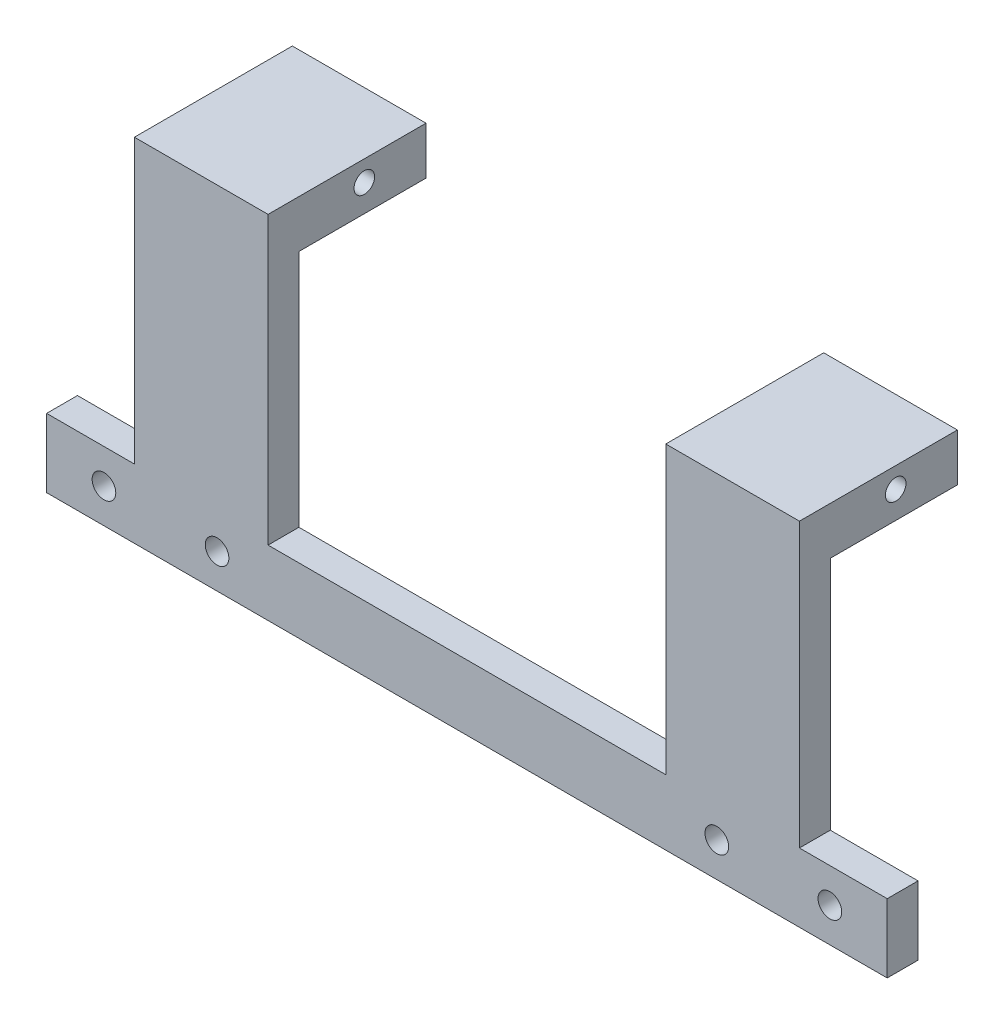
ISO-10303-21;
HEADER;
FILE_DESCRIPTION(('STEP AP214'),'2;1');
FILE_NAME('part.step','',(''),(''),'','','');
FILE_SCHEMA(('AUTOMOTIVE_DESIGN { 1 0 10303 214 1 1 1 1 }'));
ENDSEC;
DATA;
#1=APPLICATION_CONTEXT('core data for automotive mechanical design processes');
#2=APPLICATION_PROTOCOL_DEFINITION('international standard','automotive_design',2000,#1);
#3=PRODUCT_CONTEXT('',#1,'mechanical');
#4=PRODUCT('Part','Part','',(#3));
#5=PRODUCT_RELATED_PRODUCT_CATEGORY('part','',(#4));
#6=PRODUCT_DEFINITION_FORMATION('','',#4);
#7=PRODUCT_DEFINITION_CONTEXT('part definition',#1,'design');
#8=PRODUCT_DEFINITION('design','',#6,#7);
#9=PRODUCT_DEFINITION_SHAPE('','',#8);
#10=(LENGTH_UNIT() NAMED_UNIT(*) SI_UNIT(.MILLI.,.METRE.));
#11=(NAMED_UNIT(*) PLANE_ANGLE_UNIT() SI_UNIT($,.RADIAN.));
#12=(NAMED_UNIT(*) SI_UNIT($,.STERADIAN.) SOLID_ANGLE_UNIT());
#13=UNCERTAINTY_MEASURE_WITH_UNIT(LENGTH_MEASURE(1.E-05),#10,'distance_accuracy_value','');
#14=(GEOMETRIC_REPRESENTATION_CONTEXT(3) GLOBAL_UNCERTAINTY_ASSIGNED_CONTEXT((#13)) GLOBAL_UNIT_ASSIGNED_CONTEXT((#10,
#11,#12)) REPRESENTATION_CONTEXT('',''));
#15=CARTESIAN_POINT('',(0.,0.,0.));
#16=DIRECTION('',(0.,0.,1.));
#17=DIRECTION('',(1.,0.,0.));
#18=AXIS2_PLACEMENT_3D('',#15,#16,#17);
#19=CARTESIAN_POINT('',(0.,0.,0.));
#20=DIRECTION('',(0.,0.,-1.));
#21=DIRECTION('',(-1.,0.,0.));
#22=AXIS2_PLACEMENT_3D('',#19,#20,#21);
#23=PLANE('',#22);
#24=CARTESIAN_POINT('',(56.8005544708612,-20.0406329442169,0.));
#25=DIRECTION('',(0.,0.,1.));
#26=DIRECTION('',(1.,0.,0.));
#27=AXIS2_PLACEMENT_3D('',#24,#25,#26);
#28=CIRCLE('',#27,1.14999935865037);
#29=CARTESIAN_POINT('',(57.9505538295116,-20.0406329442169,0.));
#30=VERTEX_POINT('',#29);
#31=EDGE_CURVE('E313',#30,#30,#28,.T.);
#32=ORIENTED_EDGE('',*,*,#31,.T.);
#33=EDGE_LOOP('',(#32));
#34=FACE_BOUND('',#33,.T.);
#35=CARTESIAN_POINT('',(-2.80055503366175,-20.0406322554881,0.));
#36=DIRECTION('',(0.,0.,1.));
#37=DIRECTION('',(1.,0.,0.));
#38=AXIS2_PLACEMENT_3D('',#35,#36,#37);
#39=CIRCLE('',#38,1.14999938871987);
#40=CARTESIAN_POINT('',(-1.65055564494188,-20.0406322554881,0.));
#41=VERTEX_POINT('',#40);
#42=EDGE_CURVE('E329',#41,#41,#39,.T.);
#43=ORIENTED_EDGE('',*,*,#42,.T.);
#44=EDGE_LOOP('',(#43));
#45=FACE_BOUND('',#44,.T.);
#46=CARTESIAN_POINT('',(8.19944443061426,-20.0406321827626,0.));
#47=DIRECTION('',(0.,0.,1.));
#48=DIRECTION('',(1.,0.,0.));
#49=AXIS2_PLACEMENT_3D('',#46,#47,#48);
#50=CIRCLE('',#49,1.14999955336812);
#51=CARTESIAN_POINT('',(9.34944398398237,-20.0406321827626,0.));
#52=VERTEX_POINT('',#51);
#53=EDGE_CURVE('E321',#52,#52,#50,.T.);
#54=ORIENTED_EDGE('',*,*,#53,.T.);
#55=EDGE_LOOP('',(#54));
#56=FACE_BOUND('',#55,.T.);
#57=CARTESIAN_POINT('',(67.8005549150227,-20.0406250576774,0.));
#58=DIRECTION('',(0.,0.,1.));
#59=DIRECTION('',(1.,0.,0.));
#60=AXIS2_PLACEMENT_3D('',#57,#58,#59);
#61=CIRCLE('',#60,1.14999755177245);
#62=CARTESIAN_POINT('',(68.9505524667952,-20.0406250576774,0.));
#63=VERTEX_POINT('',#62);
#64=EDGE_CURVE('E308',#63,#63,#61,.T.);
#65=ORIENTED_EDGE('',*,*,#64,.T.);
#66=EDGE_LOOP('',(#65));
#67=FACE_BOUND('',#66,.T.);
#68=DIRECTION('',(0.,-1.,0.));
#69=VECTOR('',#68,1.);
#70=CARTESIAN_POINT('',(0.161137253046036,-16.7000007629395,0.));
#71=LINE('',#70,#69);
#72=CARTESIAN_POINT('',(0.161137253046036,6.20039393615723,0.));
#73=VERTEX_POINT('',#72);
#74=CARTESIAN_POINT('',(0.161137253046036,-16.7000007629395,0.));
#75=VERTEX_POINT('',#74);
#76=EDGE_CURVE('E164',#73,#75,#71,.T.);
#77=ORIENTED_EDGE('',*,*,#76,.F.);
#78=DIRECTION('',(-1.,0.,0.));
#79=VECTOR('',#78,1.);
#80=CARTESIAN_POINT('',(13.1611375808716,6.20039393615723,0.));
#81=LINE('',#80,#79);
#82=CARTESIAN_POINT('',(13.1611375808716,6.20039393615723,0.));
#83=VERTEX_POINT('',#82);
#84=EDGE_CURVE('E375',#83,#73,#81,.T.);
#85=ORIENTED_EDGE('',*,*,#84,.F.);
#86=DIRECTION('',(0.,1.,0.));
#87=VECTOR('',#86,1.);
#88=CARTESIAN_POINT('',(13.1611375808716,10.8283939361572,0.));
#89=LINE('',#88,#87);
#90=CARTESIAN_POINT('',(13.1611375808716,-17.0268955230713,0.));
#91=VERTEX_POINT('',#90);
#92=EDGE_CURVE('E190',#91,#83,#89,.T.);
#93=ORIENTED_EDGE('',*,*,#92,.F.);
#94=DIRECTION('',(-1.,0.,0.));
#95=VECTOR('',#94,1.);
#96=CARTESIAN_POINT('',(13.1611375808716,-17.0268955230713,0.));
#97=LINE('',#96,#95);
#98=CARTESIAN_POINT('',(51.8388633728027,-17.0268955230713,0.));
#99=VERTEX_POINT('',#98);
#100=EDGE_CURVE('E99',#99,#91,#97,.T.);
#101=ORIENTED_EDGE('',*,*,#100,.F.);
#102=DIRECTION('',(0.,-1.,0.));
#103=VECTOR('',#102,1.);
#104=CARTESIAN_POINT('',(51.8388633728027,-17.0268955230713,0.));
#105=LINE('',#104,#103);
#106=CARTESIAN_POINT('',(51.8388633728027,6.20039393615723,0.));
#107=VERTEX_POINT('',#106);
#108=EDGE_CURVE('E151',#107,#99,#105,.T.);
#109=ORIENTED_EDGE('',*,*,#108,.F.);
#110=DIRECTION('',(-1.,0.,0.));
#111=VECTOR('',#110,1.);
#112=CARTESIAN_POINT('',(64.8388595581055,6.20039393615723,0.));
#113=LINE('',#112,#111);
#114=CARTESIAN_POINT('',(64.8388595581055,6.20039393615723,0.));
#115=VERTEX_POINT('',#114);
#116=EDGE_CURVE('E56',#115,#107,#113,.T.);
#117=ORIENTED_EDGE('',*,*,#116,.F.);
#118=DIRECTION('',(0.,1.,0.));
#119=VECTOR('',#118,1.);
#120=CARTESIAN_POINT('',(64.8388595581055,10.8283939361572,0.));
#121=LINE('',#120,#119);
#122=CARTESIAN_POINT('',(64.8388595581055,-16.7000007629395,0.));
#123=VERTEX_POINT('',#122);
#124=EDGE_CURVE('E183',#123,#115,#121,.T.);
#125=ORIENTED_EDGE('',*,*,#124,.F.);
#126=DIRECTION('',(-1.,0.,0.));
#127=VECTOR('',#126,1.);
#128=CARTESIAN_POINT('',(64.8388595581055,-16.7000007629395,0.));
#129=LINE('',#128,#127);
#130=CARTESIAN_POINT('',(73.3760375976562,-16.7000007629395,0.));
#131=VERTEX_POINT('',#130);
#132=EDGE_CURVE('E180',#131,#123,#129,.T.);
#133=ORIENTED_EDGE('',*,*,#132,.F.);
#134=DIRECTION('',(0.,1.,0.));
#135=VECTOR('',#134,1.);
#136=CARTESIAN_POINT('',(73.3760375976562,-16.7000007629395,0.));
#137=LINE('',#136,#135);
#138=CARTESIAN_POINT('',(73.3760375976562,-23.3812656402588,0.));
#139=VERTEX_POINT('',#138);
#140=EDGE_CURVE('E177',#139,#131,#137,.T.);
#141=ORIENTED_EDGE('',*,*,#140,.F.);
#142=DIRECTION('',(1.,0.,0.));
#143=VECTOR('',#142,1.);
#144=CARTESIAN_POINT('',(73.3760375976562,-23.3812656402588,0.));
#145=LINE('',#144,#143);
#146=CARTESIAN_POINT('',(-8.3760404586792,-23.3812656402588,0.));
#147=VERTEX_POINT('',#146);
#148=EDGE_CURVE('E174',#147,#139,#145,.T.);
#149=ORIENTED_EDGE('',*,*,#148,.F.);
#150=DIRECTION('',(0.,-1.,0.));
#151=VECTOR('',#150,1.);
#152=CARTESIAN_POINT('',(-8.3760404586792,-23.3812656402588,0.));
#153=LINE('',#152,#151);
#154=CARTESIAN_POINT('',(-8.3760404586792,-16.7000007629395,0.));
#155=VERTEX_POINT('',#154);
#156=EDGE_CURVE('E171',#155,#147,#153,.T.);
#157=ORIENTED_EDGE('',*,*,#156,.F.);
#158=DIRECTION('',(-1.,0.,0.));
#159=VECTOR('',#158,1.);
#160=CARTESIAN_POINT('',(-8.3760404586792,-16.7000007629395,0.));
#161=LINE('',#160,#159);
#162=EDGE_CURVE('E167',#75,#155,#161,.T.);
#163=ORIENTED_EDGE('',*,*,#162,.F.);
#164=EDGE_LOOP('',(#77,#85,#93,#101,#109,#117,#125,#133,#141,#149,#157,#163));
#165=FACE_BOUND('',#164,.T.);
#166=ADVANCED_FACE('F39',(#34,#45,#56,#67,#165),#23,.T.);
#167=CARTESIAN_POINT('',(0.,0.,3.));
#168=DIRECTION('',(0.,0.,-1.));
#169=DIRECTION('',(-1.,0.,0.));
#170=AXIS2_PLACEMENT_3D('',#167,#168,#169);
#171=PLANE('',#170);
#172=DIRECTION('',(-1.,0.,0.));
#173=VECTOR('',#172,1.);
#174=CARTESIAN_POINT('',(0.161137253046036,10.8283939361572,3.));
#175=LINE('',#174,#173);
#176=CARTESIAN_POINT('',(13.1611375808716,10.8283939361572,3.));
#177=VERTEX_POINT('',#176);
#178=CARTESIAN_POINT('',(0.161137253046036,10.8283939361572,3.));
#179=VERTEX_POINT('',#178);
#180=EDGE_CURVE('E194',#177,#179,#175,.T.);
#181=ORIENTED_EDGE('',*,*,#180,.T.);
#182=DIRECTION('',(0.,-1.,0.));
#183=VECTOR('',#182,1.);
#184=CARTESIAN_POINT('',(0.161137253046036,-16.7000007629395,3.));
#185=LINE('',#184,#183);
#186=CARTESIAN_POINT('',(0.161137253046036,-16.7000007629395,3.));
#187=VERTEX_POINT('',#186);
#188=EDGE_CURVE('E107',#179,#187,#185,.T.);
#189=ORIENTED_EDGE('',*,*,#188,.T.);
#190=DIRECTION('',(-1.,0.,0.));
#191=VECTOR('',#190,1.);
#192=CARTESIAN_POINT('',(-8.3760404586792,-16.7000007629395,3.));
#193=LINE('',#192,#191);
#194=CARTESIAN_POINT('',(-8.3760404586792,-16.7000007629395,3.));
#195=VERTEX_POINT('',#194);
#196=EDGE_CURVE('E233',#187,#195,#193,.T.);
#197=ORIENTED_EDGE('',*,*,#196,.T.);
#198=DIRECTION('',(0.,-1.,0.));
#199=VECTOR('',#198,1.);
#200=CARTESIAN_POINT('',(-8.3760404586792,-23.3812656402588,3.));
#201=LINE('',#200,#199);
#202=CARTESIAN_POINT('',(-8.3760404586792,-23.3812656402588,3.));
#203=VERTEX_POINT('',#202);
#204=EDGE_CURVE('E252',#195,#203,#201,.T.);
#205=ORIENTED_EDGE('',*,*,#204,.T.);
#206=DIRECTION('',(1.,0.,0.));
#207=VECTOR('',#206,1.);
#208=CARTESIAN_POINT('',(73.3760375976562,-23.3812656402588,3.));
#209=LINE('',#208,#207);
#210=CARTESIAN_POINT('',(73.3760375976562,-23.3812656402588,3.));
#211=VERTEX_POINT('',#210);
#212=EDGE_CURVE('E248',#203,#211,#209,.T.);
#213=ORIENTED_EDGE('',*,*,#212,.T.);
#214=DIRECTION('',(0.,1.,0.));
#215=VECTOR('',#214,1.);
#216=CARTESIAN_POINT('',(73.3760375976562,-16.7000007629395,3.));
#217=LINE('',#216,#215);
#218=CARTESIAN_POINT('',(73.3760375976562,-16.7000007629395,3.));
#219=VERTEX_POINT('',#218);
#220=EDGE_CURVE('E251',#211,#219,#217,.T.);
#221=ORIENTED_EDGE('',*,*,#220,.T.);
#222=DIRECTION('',(-1.,0.,0.));
#223=VECTOR('',#222,1.);
#224=CARTESIAN_POINT('',(64.8388595581055,-16.7000007629395,3.));
#225=LINE('',#224,#223);
#226=CARTESIAN_POINT('',(64.8388595581055,-16.7000007629395,3.));
#227=VERTEX_POINT('',#226);
#228=EDGE_CURVE('E256',#219,#227,#225,.T.);
#229=ORIENTED_EDGE('',*,*,#228,.T.);
#230=DIRECTION('',(0.,1.,0.));
#231=VECTOR('',#230,1.);
#232=CARTESIAN_POINT('',(64.8388595581055,10.8283939361572,3.));
#233=LINE('',#232,#231);
#234=CARTESIAN_POINT('',(64.8388595581055,10.8283939361572,3.));
#235=VERTEX_POINT('',#234);
#236=EDGE_CURVE('E263',#227,#235,#233,.T.);
#237=ORIENTED_EDGE('',*,*,#236,.T.);
#238=DIRECTION('',(-1.,0.,0.));
#239=VECTOR('',#238,1.);
#240=CARTESIAN_POINT('',(51.8388633728027,10.8283939361572,3.));
#241=LINE('',#240,#239);
#242=CARTESIAN_POINT('',(51.8388633728027,10.8283939361572,3.));
#243=VERTEX_POINT('',#242);
#244=EDGE_CURVE('E142',#235,#243,#241,.T.);
#245=ORIENTED_EDGE('',*,*,#244,.T.);
#246=DIRECTION('',(0.,-1.,0.));
#247=VECTOR('',#246,1.);
#248=CARTESIAN_POINT('',(51.8388633728027,-17.0268955230713,3.));
#249=LINE('',#248,#247);
#250=CARTESIAN_POINT('',(51.8388633728027,-17.0268955230713,3.));
#251=VERTEX_POINT('',#250);
#252=EDGE_CURVE('E135',#243,#251,#249,.T.);
#253=ORIENTED_EDGE('',*,*,#252,.T.);
#254=DIRECTION('',(-1.,0.,0.));
#255=VECTOR('',#254,1.);
#256=CARTESIAN_POINT('',(13.1611375808716,-17.0268955230713,3.));
#257=LINE('',#256,#255);
#258=CARTESIAN_POINT('',(13.1611375808716,-17.0268955230713,3.));
#259=VERTEX_POINT('',#258);
#260=EDGE_CURVE('E140',#251,#259,#257,.T.);
#261=ORIENTED_EDGE('',*,*,#260,.T.);
#262=DIRECTION('',(0.,1.,0.));
#263=VECTOR('',#262,1.);
#264=CARTESIAN_POINT('',(13.1611375808716,10.8283939361572,3.));
#265=LINE('',#264,#263);
#266=EDGE_CURVE('E65',#259,#177,#265,.T.);
#267=ORIENTED_EDGE('',*,*,#266,.T.);
#268=EDGE_LOOP('',(#181,#189,#197,#205,#213,#221,#229,#237,#245,#253,#261,#267));
#269=FACE_BOUND('',#268,.T.);
#270=CARTESIAN_POINT('',(-2.80055503366175,-20.0406322554881,3.));
#271=DIRECTION('',(0.,0.,1.));
#272=DIRECTION('',(1.,0.,0.));
#273=AXIS2_PLACEMENT_3D('',#270,#271,#272);
#274=CIRCLE('',#273,1.14999938871987);
#275=CARTESIAN_POINT('',(-1.65055564494188,-20.0406322554881,3.));
#276=VERTEX_POINT('',#275);
#277=EDGE_CURVE('E168',#276,#276,#274,.T.);
#278=ORIENTED_EDGE('',*,*,#277,.F.);
#279=EDGE_LOOP('',(#278));
#280=FACE_BOUND('',#279,.T.);
#281=CARTESIAN_POINT('',(8.19944443061426,-20.0406321827626,3.));
#282=DIRECTION('',(0.,0.,1.));
#283=DIRECTION('',(1.,0.,0.));
#284=AXIS2_PLACEMENT_3D('',#281,#282,#283);
#285=CIRCLE('',#284,1.14999955336812);
#286=CARTESIAN_POINT('',(9.34944398398237,-20.0406321827626,3.));
#287=VERTEX_POINT('',#286);
#288=EDGE_CURVE('E325',#287,#287,#285,.T.);
#289=ORIENTED_EDGE('',*,*,#288,.F.);
#290=EDGE_LOOP('',(#289));
#291=FACE_BOUND('',#290,.T.);
#292=CARTESIAN_POINT('',(56.8005544708612,-20.0406329442169,3.));
#293=DIRECTION('',(0.,0.,1.));
#294=DIRECTION('',(1.,0.,0.));
#295=AXIS2_PLACEMENT_3D('',#292,#293,#294);
#296=CIRCLE('',#295,1.14999935865037);
#297=CARTESIAN_POINT('',(57.9505538295116,-20.0406329442169,3.));
#298=VERTEX_POINT('',#297);
#299=EDGE_CURVE('E317',#298,#298,#296,.T.);
#300=ORIENTED_EDGE('',*,*,#299,.F.);
#301=EDGE_LOOP('',(#300));
#302=FACE_BOUND('',#301,.T.);
#303=CARTESIAN_POINT('',(67.8005549150227,-20.0406250576774,3.));
#304=DIRECTION('',(0.,0.,1.));
#305=DIRECTION('',(1.,0.,0.));
#306=AXIS2_PLACEMENT_3D('',#303,#304,#305);
#307=CIRCLE('',#306,1.14999755177245);
#308=CARTESIAN_POINT('',(68.9505524667952,-20.0406250576774,3.));
#309=VERTEX_POINT('',#308);
#310=EDGE_CURVE('E309',#309,#309,#307,.T.);
#311=ORIENTED_EDGE('',*,*,#310,.F.);
#312=EDGE_LOOP('',(#311));
#313=FACE_BOUND('',#312,.T.);
#314=ADVANCED_FACE('F137',(#269,#280,#291,#302,#313),#171,.F.);
#315=CARTESIAN_POINT('',(0.161137253046036,10.8283939361572,3.));
#316=DIRECTION('',(0.,-1.,0.));
#317=DIRECTION('',(0.,0.,-1.));
#318=AXIS2_PLACEMENT_3D('',#315,#316,#317);
#319=PLANE('',#318);
#320=DIRECTION('',(0.,0.,-1.));
#321=VECTOR('',#320,1.);
#322=CARTESIAN_POINT('',(13.1611375808716,10.8283939361572,3.));
#323=LINE('',#322,#321);
#324=CARTESIAN_POINT('',(13.1611375808716,10.8283939361572,-12.361));
#325=VERTEX_POINT('',#324);
#326=EDGE_CURVE('E160',#177,#325,#323,.T.);
#327=ORIENTED_EDGE('',*,*,#326,.T.);
#328=DIRECTION('',(1.,0.,0.));
#329=VECTOR('',#328,1.);
#330=CARTESIAN_POINT('',(0.161137253046036,10.8283939361572,-12.361));
#331=LINE('',#330,#329);
#332=CARTESIAN_POINT('',(0.161137253046036,10.8283939361572,-12.361));
#333=VERTEX_POINT('',#332);
#334=EDGE_CURVE('E349',#333,#325,#331,.T.);
#335=ORIENTED_EDGE('',*,*,#334,.F.);
#336=DIRECTION('',(0.,0.,-1.));
#337=VECTOR('',#336,1.);
#338=CARTESIAN_POINT('',(0.161137253046036,10.8283939361572,3.));
#339=LINE('',#338,#337);
#340=EDGE_CURVE('E11',#179,#333,#339,.T.);
#341=ORIENTED_EDGE('',*,*,#340,.F.);
#342=ORIENTED_EDGE('',*,*,#180,.F.);
#343=EDGE_LOOP('',(#327,#335,#341,#342));
#344=FACE_BOUND('',#343,.T.);
#345=ADVANCED_FACE('F41',(#344),#319,.F.);
#346=CARTESIAN_POINT('',(0.161137253046036,-16.7000007629395,3.));
#347=DIRECTION('',(1.,0.,0.));
#348=DIRECTION('',(0.,0.,-1.));
#349=AXIS2_PLACEMENT_3D('',#346,#347,#348);
#350=PLANE('',#349);
#351=CARTESIAN_POINT('',(0.161137253046034,8.82839393615723,-6.361));
#352=DIRECTION('',(1.,0.,0.));
#353=DIRECTION('',(0.,0.,-1.));
#354=AXIS2_PLACEMENT_3D('',#351,#352,#353);
#355=CIRCLE('',#354,1.);
#356=CARTESIAN_POINT('',(0.161137253046034,8.82839393615723,-7.361));
#357=VERTEX_POINT('',#356);
#358=EDGE_CURVE('E378',#357,#357,#355,.T.);
#359=ORIENTED_EDGE('',*,*,#358,.T.);
#360=EDGE_LOOP('',(#359));
#361=FACE_BOUND('',#360,.T.);
#362=ORIENTED_EDGE('',*,*,#340,.T.);
#363=DIRECTION('',(0.,1.,0.));
#364=VECTOR('',#363,1.);
#365=CARTESIAN_POINT('',(0.161137253046036,6.20039393615723,-12.361));
#366=LINE('',#365,#364);
#367=CARTESIAN_POINT('',(0.161137253046036,6.20039393615723,-12.361));
#368=VERTEX_POINT('',#367);
#369=EDGE_CURVE('E355',#368,#333,#366,.T.);
#370=ORIENTED_EDGE('',*,*,#369,.F.);
#371=DIRECTION('',(0.,0.,1.));
#372=VECTOR('',#371,1.);
#373=CARTESIAN_POINT('',(0.161137253046036,6.20039393615723,-12.361));
#374=LINE('',#373,#372);
#375=EDGE_CURVE('E366',#368,#73,#374,.T.);
#376=ORIENTED_EDGE('',*,*,#375,.T.);
#377=ORIENTED_EDGE('',*,*,#76,.T.);
#378=DIRECTION('',(0.,0.,-1.));
#379=VECTOR('',#378,1.);
#380=CARTESIAN_POINT('',(0.161137253046036,-16.7000007629395,3.));
#381=LINE('',#380,#379);
#382=EDGE_CURVE('E49',#187,#75,#381,.T.);
#383=ORIENTED_EDGE('',*,*,#382,.F.);
#384=ORIENTED_EDGE('',*,*,#188,.F.);
#385=EDGE_LOOP('',(#362,#370,#376,#377,#383,#384));
#386=FACE_BOUND('',#385,.T.);
#387=ADVANCED_FACE('F352',(#361,#386),#350,.F.);
#388=CARTESIAN_POINT('',(-8.3760404586792,-16.7000007629395,3.));
#389=DIRECTION('',(0.,-1.,0.));
#390=DIRECTION('',(0.,0.,-1.));
#391=AXIS2_PLACEMENT_3D('',#388,#389,#390);
#392=PLANE('',#391);
#393=ORIENTED_EDGE('',*,*,#162,.T.);
#394=DIRECTION('',(0.,0.,-1.));
#395=VECTOR('',#394,1.);
#396=CARTESIAN_POINT('',(-8.3760404586792,-16.7000007629395,3.));
#397=LINE('',#396,#395);
#398=EDGE_CURVE('E222',#195,#155,#397,.T.);
#399=ORIENTED_EDGE('',*,*,#398,.F.);
#400=ORIENTED_EDGE('',*,*,#196,.F.);
#401=ORIENTED_EDGE('',*,*,#382,.T.);
#402=EDGE_LOOP('',(#393,#399,#400,#401));
#403=FACE_BOUND('',#402,.T.);
#404=ADVANCED_FACE('F231',(#403),#392,.F.);
#405=CARTESIAN_POINT('',(-8.3760404586792,-23.3812656402588,3.));
#406=DIRECTION('',(1.,0.,0.));
#407=DIRECTION('',(0.,0.,-1.));
#408=AXIS2_PLACEMENT_3D('',#405,#406,#407);
#409=PLANE('',#408);
#410=ORIENTED_EDGE('',*,*,#156,.T.);
#411=DIRECTION('',(0.,0.,-1.));
#412=VECTOR('',#411,1.);
#413=CARTESIAN_POINT('',(-8.3760404586792,-23.3812656402588,3.));
#414=LINE('',#413,#412);
#415=EDGE_CURVE('E218',#203,#147,#414,.T.);
#416=ORIENTED_EDGE('',*,*,#415,.F.);
#417=ORIENTED_EDGE('',*,*,#204,.F.);
#418=ORIENTED_EDGE('',*,*,#398,.T.);
#419=EDGE_LOOP('',(#410,#416,#417,#418));
#420=FACE_BOUND('',#419,.T.);
#421=ADVANCED_FACE('F242',(#420),#409,.F.);
#422=CARTESIAN_POINT('',(73.3760375976562,-23.3812656402588,3.));
#423=DIRECTION('',(0.,1.,0.));
#424=DIRECTION('',(0.,0.,1.));
#425=AXIS2_PLACEMENT_3D('',#422,#423,#424);
#426=PLANE('',#425);
#427=ORIENTED_EDGE('',*,*,#148,.T.);
#428=DIRECTION('',(0.,0.,-1.));
#429=VECTOR('',#428,1.);
#430=CARTESIAN_POINT('',(73.3760375976562,-23.3812656402588,3.));
#431=LINE('',#430,#429);
#432=EDGE_CURVE('E214',#211,#139,#431,.T.);
#433=ORIENTED_EDGE('',*,*,#432,.F.);
#434=ORIENTED_EDGE('',*,*,#212,.F.);
#435=ORIENTED_EDGE('',*,*,#415,.T.);
#436=EDGE_LOOP('',(#427,#433,#434,#435));
#437=FACE_BOUND('',#436,.T.);
#438=ADVANCED_FACE('F246',(#437),#426,.F.);
#439=CARTESIAN_POINT('',(73.3760375976562,-16.7000007629395,3.));
#440=DIRECTION('',(-1.,0.,0.));
#441=DIRECTION('',(0.,0.,1.));
#442=AXIS2_PLACEMENT_3D('',#439,#440,#441);
#443=PLANE('',#442);
#444=ORIENTED_EDGE('',*,*,#140,.T.);
#445=DIRECTION('',(0.,0.,-1.));
#446=VECTOR('',#445,1.);
#447=CARTESIAN_POINT('',(73.3760375976562,-16.7000007629395,3.));
#448=LINE('',#447,#446);
#449=EDGE_CURVE('E210',#219,#131,#448,.T.);
#450=ORIENTED_EDGE('',*,*,#449,.F.);
#451=ORIENTED_EDGE('',*,*,#220,.F.);
#452=ORIENTED_EDGE('',*,*,#432,.T.);
#453=EDGE_LOOP('',(#444,#450,#451,#452));
#454=FACE_BOUND('',#453,.T.);
#455=ADVANCED_FACE('F462',(#454),#443,.F.);
#456=CARTESIAN_POINT('',(64.8388595581055,-16.7000007629395,3.));
#457=DIRECTION('',(0.,-1.,0.));
#458=DIRECTION('',(0.,0.,-1.));
#459=AXIS2_PLACEMENT_3D('',#456,#457,#458);
#460=PLANE('',#459);
#461=ORIENTED_EDGE('',*,*,#132,.T.);
#462=DIRECTION('',(0.,0.,-1.));
#463=VECTOR('',#462,1.);
#464=CARTESIAN_POINT('',(64.8388595581055,-16.7000007629395,3.));
#465=LINE('',#464,#463);
#466=EDGE_CURVE('E206',#227,#123,#465,.T.);
#467=ORIENTED_EDGE('',*,*,#466,.F.);
#468=ORIENTED_EDGE('',*,*,#228,.F.);
#469=ORIENTED_EDGE('',*,*,#449,.T.);
#470=EDGE_LOOP('',(#461,#467,#468,#469));
#471=FACE_BOUND('',#470,.T.);
#472=ADVANCED_FACE('F458',(#471),#460,.F.);
#473=CARTESIAN_POINT('',(64.8388595581055,10.8283939361572,3.));
#474=DIRECTION('',(-1.,0.,0.));
#475=DIRECTION('',(0.,0.,1.));
#476=AXIS2_PLACEMENT_3D('',#473,#474,#475);
#477=PLANE('',#476);
#478=CARTESIAN_POINT('',(64.8388595581055,8.82839393615723,-6.361));
#479=DIRECTION('',(1.,0.,0.));
#480=DIRECTION('',(0.,0.,-1.));
#481=AXIS2_PLACEMENT_3D('',#478,#479,#480);
#482=CIRCLE('',#481,1.);
#483=CARTESIAN_POINT('',(64.8388595581055,8.82839393615723,-7.361));
#484=VERTEX_POINT('',#483);
#485=EDGE_CURVE('E413',#484,#484,#482,.T.);
#486=ORIENTED_EDGE('',*,*,#485,.F.);
#487=EDGE_LOOP('',(#486));
#488=FACE_BOUND('',#487,.T.);
#489=ORIENTED_EDGE('',*,*,#124,.T.);
#490=DIRECTION('',(0.,0.,1.));
#491=VECTOR('',#490,1.);
#492=CARTESIAN_POINT('',(64.8388595581055,6.20039393615723,-12.361));
#493=LINE('',#492,#491);
#494=CARTESIAN_POINT('',(64.8388595581055,6.20039393615723,-12.361));
#495=VERTEX_POINT('',#494);
#496=EDGE_CURVE('E297',#495,#115,#493,.T.);
#497=ORIENTED_EDGE('',*,*,#496,.F.);
#498=DIRECTION('',(0.,-1.,0.));
#499=VECTOR('',#498,1.);
#500=CARTESIAN_POINT('',(64.8388595581055,10.8283939361572,-12.361));
#501=LINE('',#500,#499);
#502=CARTESIAN_POINT('',(64.8388595581055,10.8283939361572,-12.361));
#503=VERTEX_POINT('',#502);
#504=EDGE_CURVE('E276',#503,#495,#501,.T.);
#505=ORIENTED_EDGE('',*,*,#504,.F.);
#506=DIRECTION('',(0.,0.,-1.));
#507=VECTOR('',#506,1.);
#508=CARTESIAN_POINT('',(64.8388595581055,10.8283939361572,3.));
#509=LINE('',#508,#507);
#510=EDGE_CURVE('E202',#235,#503,#509,.T.);
#511=ORIENTED_EDGE('',*,*,#510,.F.);
#512=ORIENTED_EDGE('',*,*,#236,.F.);
#513=ORIENTED_EDGE('',*,*,#466,.T.);
#514=EDGE_LOOP('',(#489,#497,#505,#511,#512,#513));
#515=FACE_BOUND('',#514,.T.);
#516=ADVANCED_FACE('F272',(#488,#515),#477,.F.);
#517=CARTESIAN_POINT('',(51.8388633728027,10.8283939361572,3.));
#518=DIRECTION('',(0.,-1.,0.));
#519=DIRECTION('',(0.,0.,-1.));
#520=AXIS2_PLACEMENT_3D('',#517,#518,#519);
#521=PLANE('',#520);
#522=ORIENTED_EDGE('',*,*,#510,.T.);
#523=DIRECTION('',(1.,0.,0.));
#524=VECTOR('',#523,1.);
#525=CARTESIAN_POINT('',(51.8388633728027,10.8283939361572,-12.361));
#526=LINE('',#525,#524);
#527=CARTESIAN_POINT('',(51.8388633728027,10.8283939361572,-12.361));
#528=VERTEX_POINT('',#527);
#529=EDGE_CURVE('E281',#528,#503,#526,.T.);
#530=ORIENTED_EDGE('',*,*,#529,.F.);
#531=DIRECTION('',(0.,0.,-1.));
#532=VECTOR('',#531,1.);
#533=CARTESIAN_POINT('',(51.8388633728027,10.8283939361572,3.));
#534=LINE('',#533,#532);
#535=EDGE_CURVE('E153',#243,#528,#534,.T.);
#536=ORIENTED_EDGE('',*,*,#535,.F.);
#537=ORIENTED_EDGE('',*,*,#244,.F.);
#538=EDGE_LOOP('',(#522,#530,#536,#537));
#539=FACE_BOUND('',#538,.T.);
#540=ADVANCED_FACE('F280',(#539),#521,.F.);
#541=CARTESIAN_POINT('',(51.8388633728027,-17.0268955230713,3.));
#542=DIRECTION('',(1.,0.,0.));
#543=DIRECTION('',(0.,0.,-1.));
#544=AXIS2_PLACEMENT_3D('',#541,#542,#543);
#545=PLANE('',#544);
#546=CARTESIAN_POINT('',(51.8388633728027,8.82839393615723,-6.361));
#547=DIRECTION('',(1.,0.,0.));
#548=DIRECTION('',(0.,0.,-1.));
#549=AXIS2_PLACEMENT_3D('',#546,#547,#548);
#550=CIRCLE('',#549,1.);
#551=CARTESIAN_POINT('',(51.8388633728027,8.82839393615723,-7.361));
#552=VERTEX_POINT('',#551);
#553=EDGE_CURVE('E409',#552,#552,#550,.T.);
#554=ORIENTED_EDGE('',*,*,#553,.T.);
#555=EDGE_LOOP('',(#554));
#556=FACE_BOUND('',#555,.T.);
#557=ORIENTED_EDGE('',*,*,#535,.T.);
#558=DIRECTION('',(0.,1.,0.));
#559=VECTOR('',#558,1.);
#560=CARTESIAN_POINT('',(51.8388633728027,6.20039393615723,-12.361));
#561=LINE('',#560,#559);
#562=CARTESIAN_POINT('',(51.8388633728027,6.20039393615723,-12.361));
#563=VERTEX_POINT('',#562);
#564=EDGE_CURVE('E285',#563,#528,#561,.T.);
#565=ORIENTED_EDGE('',*,*,#564,.F.);
#566=DIRECTION('',(0.,0.,1.));
#567=VECTOR('',#566,1.);
#568=CARTESIAN_POINT('',(51.8388633728027,6.20039393615723,-12.361));
#569=LINE('',#568,#567);
#570=EDGE_CURVE('E293',#563,#107,#569,.T.);
#571=ORIENTED_EDGE('',*,*,#570,.T.);
#572=ORIENTED_EDGE('',*,*,#108,.T.);
#573=DIRECTION('',(0.,0.,-1.));
#574=VECTOR('',#573,1.);
#575=CARTESIAN_POINT('',(51.8388633728027,-17.0268955230713,3.));
#576=LINE('',#575,#574);
#577=EDGE_CURVE('E148',#251,#99,#576,.T.);
#578=ORIENTED_EDGE('',*,*,#577,.F.);
#579=ORIENTED_EDGE('',*,*,#252,.F.);
#580=EDGE_LOOP('',(#557,#565,#571,#572,#578,#579));
#581=FACE_BOUND('',#580,.T.);
#582=ADVANCED_FACE('F149',(#556,#581),#545,.F.);
#583=CARTESIAN_POINT('',(13.1611375808716,-17.0268955230713,3.));
#584=DIRECTION('',(0.,-1.,0.));
#585=DIRECTION('',(0.,0.,-1.));
#586=AXIS2_PLACEMENT_3D('',#583,#584,#585);
#587=PLANE('',#586);
#588=ORIENTED_EDGE('',*,*,#100,.T.);
#589=DIRECTION('',(0.,0.,-1.));
#590=VECTOR('',#589,1.);
#591=CARTESIAN_POINT('',(13.1611375808716,-17.0268955230713,3.));
#592=LINE('',#591,#590);
#593=EDGE_CURVE('E154',#259,#91,#592,.T.);
#594=ORIENTED_EDGE('',*,*,#593,.F.);
#595=ORIENTED_EDGE('',*,*,#260,.F.);
#596=ORIENTED_EDGE('',*,*,#577,.T.);
#597=EDGE_LOOP('',(#588,#594,#595,#596));
#598=FACE_BOUND('',#597,.T.);
#599=ADVANCED_FACE('F156',(#598),#587,.F.);
#600=CARTESIAN_POINT('',(13.1611375808716,10.8283939361572,3.));
#601=DIRECTION('',(-1.,0.,0.));
#602=DIRECTION('',(0.,0.,1.));
#603=AXIS2_PLACEMENT_3D('',#600,#601,#602);
#604=PLANE('',#603);
#605=CARTESIAN_POINT('',(13.1611375808716,8.82839393615723,-6.361));
#606=DIRECTION('',(-1.,0.,0.));
#607=DIRECTION('',(0.,0.,1.));
#608=AXIS2_PLACEMENT_3D('',#605,#606,#607);
#609=CIRCLE('',#608,1.);
#610=CARTESIAN_POINT('',(13.1611375808716,8.82839393615723,-5.361));
#611=VERTEX_POINT('',#610);
#612=EDGE_CURVE('E43',#611,#611,#609,.T.);
#613=ORIENTED_EDGE('',*,*,#612,.T.);
#614=EDGE_LOOP('',(#613));
#615=FACE_BOUND('',#614,.T.);
#616=ORIENTED_EDGE('',*,*,#92,.T.);
#617=DIRECTION('',(0.,0.,1.));
#618=VECTOR('',#617,1.);
#619=CARTESIAN_POINT('',(13.1611375808716,6.20039393615723,-12.361));
#620=LINE('',#619,#618);
#621=CARTESIAN_POINT('',(13.1611375808716,6.20039393615723,-12.361));
#622=VERTEX_POINT('',#621);
#623=EDGE_CURVE('E303',#622,#83,#620,.T.);
#624=ORIENTED_EDGE('',*,*,#623,.F.);
#625=DIRECTION('',(0.,-1.,0.));
#626=VECTOR('',#625,1.);
#627=CARTESIAN_POINT('',(13.1611375808716,10.8283939361572,-12.361));
#628=LINE('',#627,#626);
#629=EDGE_CURVE('E371',#325,#622,#628,.T.);
#630=ORIENTED_EDGE('',*,*,#629,.F.);
#631=ORIENTED_EDGE('',*,*,#326,.F.);
#632=ORIENTED_EDGE('',*,*,#266,.F.);
#633=ORIENTED_EDGE('',*,*,#593,.T.);
#634=EDGE_LOOP('',(#616,#624,#630,#631,#632,#633));
#635=FACE_BOUND('',#634,.T.);
#636=ADVANCED_FACE('F401',(#615,#635),#604,.F.);
#637=CARTESIAN_POINT('',(-2.80055503366175,-20.0406322554881,3.));
#638=DIRECTION('',(0.,0.,-1.));
#639=DIRECTION('',(-1.,0.,0.));
#640=AXIS2_PLACEMENT_3D('',#637,#638,#639);
#641=CYLINDRICAL_SURFACE('',#640,1.14999938871987);
#642=ORIENTED_EDGE('',*,*,#277,.T.);
#643=EDGE_LOOP('',(#642));
#644=FACE_BOUND('',#643,.T.);
#645=ORIENTED_EDGE('',*,*,#42,.F.);
#646=EDGE_LOOP('',(#645));
#647=FACE_BOUND('',#646,.T.);
#648=ADVANCED_FACE('F448',(#644,#647),#641,.F.);
#649=CARTESIAN_POINT('',(8.19944443061426,-20.0406321827626,3.));
#650=DIRECTION('',(0.,0.,-1.));
#651=DIRECTION('',(-1.,0.,0.));
#652=AXIS2_PLACEMENT_3D('',#649,#650,#651);
#653=CYLINDRICAL_SURFACE('',#652,1.14999955336812);
#654=ORIENTED_EDGE('',*,*,#288,.T.);
#655=EDGE_LOOP('',(#654));
#656=FACE_BOUND('',#655,.T.);
#657=ORIENTED_EDGE('',*,*,#53,.F.);
#658=EDGE_LOOP('',(#657));
#659=FACE_BOUND('',#658,.T.);
#660=ADVANCED_FACE('F515',(#656,#659),#653,.F.);
#661=CARTESIAN_POINT('',(56.8005544708612,-20.0406329442169,3.));
#662=DIRECTION('',(0.,0.,-1.));
#663=DIRECTION('',(-1.,0.,0.));
#664=AXIS2_PLACEMENT_3D('',#661,#662,#663);
#665=CYLINDRICAL_SURFACE('',#664,1.14999935865037);
#666=ORIENTED_EDGE('',*,*,#299,.T.);
#667=EDGE_LOOP('',(#666));
#668=FACE_BOUND('',#667,.T.);
#669=ORIENTED_EDGE('',*,*,#31,.F.);
#670=EDGE_LOOP('',(#669));
#671=FACE_BOUND('',#670,.T.);
#672=ADVANCED_FACE('F522',(#668,#671),#665,.F.);
#673=CARTESIAN_POINT('',(67.8005549150227,-20.0406250576774,3.));
#674=DIRECTION('',(0.,0.,-1.));
#675=DIRECTION('',(-1.,0.,0.));
#676=AXIS2_PLACEMENT_3D('',#673,#674,#675);
#677=CYLINDRICAL_SURFACE('',#676,1.14999755177245);
#678=ORIENTED_EDGE('',*,*,#310,.T.);
#679=EDGE_LOOP('',(#678));
#680=FACE_BOUND('',#679,.T.);
#681=ORIENTED_EDGE('',*,*,#64,.F.);
#682=EDGE_LOOP('',(#681));
#683=FACE_BOUND('',#682,.T.);
#684=ADVANCED_FACE('F530',(#680,#683),#677,.F.);
#685=CARTESIAN_POINT('',(64.8388595581055,6.20039393615723,-12.361));
#686=DIRECTION('',(0.,1.,0.));
#687=DIRECTION('',(0.,0.,1.));
#688=AXIS2_PLACEMENT_3D('',#685,#686,#687);
#689=PLANE('',#688);
#690=ORIENTED_EDGE('',*,*,#116,.T.);
#691=ORIENTED_EDGE('',*,*,#570,.F.);
#692=DIRECTION('',(-1.,0.,0.));
#693=VECTOR('',#692,1.);
#694=CARTESIAN_POINT('',(64.8388595581055,6.20039393615723,-12.361));
#695=LINE('',#694,#693);
#696=EDGE_CURVE('E290',#495,#563,#695,.T.);
#697=ORIENTED_EDGE('',*,*,#696,.F.);
#698=ORIENTED_EDGE('',*,*,#496,.T.);
#699=EDGE_LOOP('',(#690,#691,#697,#698));
#700=FACE_BOUND('',#699,.T.);
#701=ADVANCED_FACE('F388',(#700),#689,.F.);
#702=CARTESIAN_POINT('',(0.,0.,-12.361));
#703=DIRECTION('',(0.,0.,-1.));
#704=DIRECTION('',(-1.,0.,0.));
#705=AXIS2_PLACEMENT_3D('',#702,#703,#704);
#706=PLANE('',#705);
#707=ORIENTED_EDGE('',*,*,#529,.T.);
#708=ORIENTED_EDGE('',*,*,#504,.T.);
#709=ORIENTED_EDGE('',*,*,#696,.T.);
#710=ORIENTED_EDGE('',*,*,#564,.T.);
#711=EDGE_LOOP('',(#707,#708,#709,#710));
#712=FACE_BOUND('',#711,.T.);
#713=ADVANCED_FACE('F288',(#712),#706,.T.);
#714=CARTESIAN_POINT('',(13.1611375808716,6.20039393615723,-12.361));
#715=DIRECTION('',(0.,1.,0.));
#716=DIRECTION('',(0.,0.,1.));
#717=AXIS2_PLACEMENT_3D('',#714,#715,#716);
#718=PLANE('',#717);
#719=ORIENTED_EDGE('',*,*,#84,.T.);
#720=ORIENTED_EDGE('',*,*,#375,.F.);
#721=DIRECTION('',(-1.,0.,0.));
#722=VECTOR('',#721,1.);
#723=CARTESIAN_POINT('',(13.1611375808716,6.20039393615723,-12.361));
#724=LINE('',#723,#722);
#725=EDGE_CURVE('E363',#622,#368,#724,.T.);
#726=ORIENTED_EDGE('',*,*,#725,.F.);
#727=ORIENTED_EDGE('',*,*,#623,.T.);
#728=EDGE_LOOP('',(#719,#720,#726,#727));
#729=FACE_BOUND('',#728,.T.);
#730=ADVANCED_FACE('F550',(#729),#718,.F.);
#731=CARTESIAN_POINT('',(0.,0.,-12.361));
#732=DIRECTION('',(0.,0.,-1.));
#733=DIRECTION('',(-1.,0.,0.));
#734=AXIS2_PLACEMENT_3D('',#731,#732,#733);
#735=PLANE('',#734);
#736=ORIENTED_EDGE('',*,*,#334,.T.);
#737=ORIENTED_EDGE('',*,*,#629,.T.);
#738=ORIENTED_EDGE('',*,*,#725,.T.);
#739=ORIENTED_EDGE('',*,*,#369,.T.);
#740=EDGE_LOOP('',(#736,#737,#738,#739));
#741=FACE_BOUND('',#740,.T.);
#742=ADVANCED_FACE('F359',(#741),#735,.T.);
#743=CARTESIAN_POINT('',(-135.161140441895,8.82839393615723,-6.361));
#744=DIRECTION('',(1.,0.,0.));
#745=DIRECTION('',(0.,0.,-1.));
#746=AXIS2_PLACEMENT_3D('',#743,#744,#745);
#747=CYLINDRICAL_SURFACE('',#746,1.);
#748=ORIENTED_EDGE('',*,*,#612,.F.);
#749=EDGE_LOOP('',(#748));
#750=FACE_BOUND('',#749,.T.);
#751=ORIENTED_EDGE('',*,*,#358,.F.);
#752=EDGE_LOOP('',(#751));
#753=FACE_BOUND('',#752,.T.);
#754=ADVANCED_FACE('F423',(#750,#753),#747,.F.);
#755=ORIENTED_EDGE('',*,*,#485,.T.);
#756=EDGE_LOOP('',(#755));
#757=FACE_BOUND('',#756,.T.);
#758=ORIENTED_EDGE('',*,*,#553,.F.);
#759=EDGE_LOOP('',(#758));
#760=FACE_BOUND('',#759,.T.);
#761=ADVANCED_FACE('F426',(#757,#760),#747,.F.);
#762=CLOSED_SHELL('',(#166,#314,#345,#387,#404,#421,#438,#455,#472,#516,#540,#582,#599,#636,
#648,#660,#672,#684,#701,#713,#730,#742,#754,#761));
#763=MANIFOLD_SOLID_BREP('B2',#762);
#764=ADVANCED_BREP_SHAPE_REPRESENTATION('',(#18,#763),#14);
#765=SHAPE_DEFINITION_REPRESENTATION(#9,#764);
ENDSEC;
END-ISO-10303-21;
